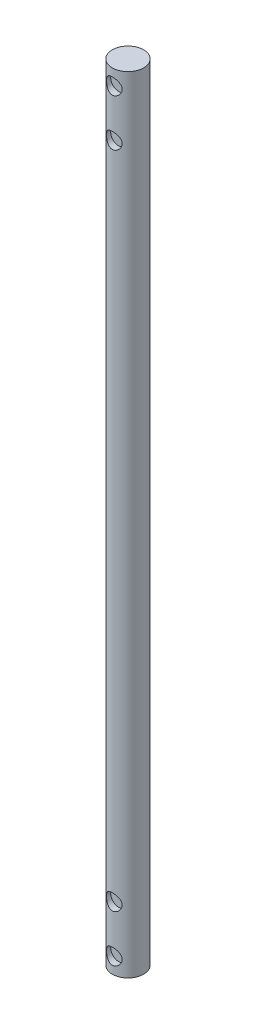
ISO-10303-21;
HEADER;
FILE_DESCRIPTION(('STEP AP214'),'2;1');
FILE_NAME('part.step','',(''),(''),'','','');
FILE_SCHEMA(('AUTOMOTIVE_DESIGN { 1 0 10303 214 1 1 1 1 }'));
ENDSEC;
DATA;
#1=APPLICATION_CONTEXT('core data for automotive mechanical design processes');
#2=APPLICATION_PROTOCOL_DEFINITION('international standard','automotive_design',2000,#1);
#3=PRODUCT_CONTEXT('',#1,'mechanical');
#4=PRODUCT('Part','Part','',(#3));
#5=PRODUCT_RELATED_PRODUCT_CATEGORY('part','',(#4));
#6=PRODUCT_DEFINITION_FORMATION('','',#4);
#7=PRODUCT_DEFINITION_CONTEXT('part definition',#1,'design');
#8=PRODUCT_DEFINITION('design','',#6,#7);
#9=PRODUCT_DEFINITION_SHAPE('','',#8);
#10=(LENGTH_UNIT() NAMED_UNIT(*) SI_UNIT(.MILLI.,.METRE.));
#11=(NAMED_UNIT(*) PLANE_ANGLE_UNIT() SI_UNIT($,.RADIAN.));
#12=(NAMED_UNIT(*) SI_UNIT($,.STERADIAN.) SOLID_ANGLE_UNIT());
#13=UNCERTAINTY_MEASURE_WITH_UNIT(LENGTH_MEASURE(1.E-05),#10,'distance_accuracy_value','');
#14=(GEOMETRIC_REPRESENTATION_CONTEXT(3) GLOBAL_UNCERTAINTY_ASSIGNED_CONTEXT((#13)) GLOBAL_UNIT_ASSIGNED_CONTEXT((#10,
#11,#12)) REPRESENTATION_CONTEXT('',''));
#15=CARTESIAN_POINT('',(0.,0.,0.));
#16=DIRECTION('',(0.,0.,1.));
#17=DIRECTION('',(1.,0.,0.));
#18=AXIS2_PLACEMENT_3D('',#15,#16,#17);
#19=CARTESIAN_POINT('',(0.,250.,0.));
#20=DIRECTION('',(0.,-1.,0.));
#21=DIRECTION('',(0.,0.,-1.));
#22=AXIS2_PLACEMENT_3D('',#19,#20,#21);
#23=CYLINDRICAL_SURFACE('',#22,5.);
#24=CARTESIAN_POINT('',(2.5,5.,4.33012701892219));
#25=CARTESIAN_POINT('',(2.49998948436432,4.86973349312351,4.33013982272992));
#26=CARTESIAN_POINT('',(2.48974954513168,4.73929727932375,4.33609541965583));
#27=CARTESIAN_POINT('',(2.44930840724944,4.48243102847077,4.35905877051907));
#28=CARTESIAN_POINT('',(2.41906526369545,4.35600999594271,4.37608974726023));
#29=CARTESIAN_POINT('',(2.3402497699757,4.11137105443893,4.41873376871659));
#30=CARTESIAN_POINT('',(2.29177485369963,3.99311342643779,4.44430111338921));
#31=CARTESIAN_POINT('',(2.17816884056414,3.76643943690545,4.50106659111455));
#32=CARTESIAN_POINT('',(2.11303684262671,3.65802360820421,4.53226502875883));
#33=CARTESIAN_POINT('',(1.96166634317253,3.44423569608308,4.59992173524851));
#34=CARTESIAN_POINT('',(1.87413008816917,3.33985216551023,4.63660159331577));
#35=CARTESIAN_POINT('',(1.68313452122752,3.1464790242868,4.70929956727453));
#36=CARTESIAN_POINT('',(1.57966731506051,3.05749709224505,4.74531734512768));
#37=CARTESIAN_POINT('',(1.35122390789082,2.89158212351436,4.81553692452135));
#38=CARTESIAN_POINT('',(1.22526797235894,2.81586558072086,4.84945266064072));
#39=CARTESIAN_POINT('',(0.960392566671146,2.68714786651614,4.90876890230193));
#40=CARTESIAN_POINT('',(0.821481345389982,2.6341323595615,4.93417477954535));
#41=CARTESIAN_POINT('',(0.545112359773522,2.55623834683603,4.9720115311507));
#42=CARTESIAN_POINT('',(0.408254476210982,2.52962618413487,4.98523700553425));
#43=CARTESIAN_POINT('',(0.131426571755676,2.49958470328871,5.00018959613973));
#44=CARTESIAN_POINT('',(-0.00854151460650916,2.49614135800464,5.00192366961168));
#45=CARTESIAN_POINT('',(-0.274581311061965,2.51186668493142,4.99407454791405));
#46=CARTESIAN_POINT('',(-0.400802997942672,2.52909503880454,4.98546239730476));
#47=CARTESIAN_POINT('',(-0.64828442979511,2.58220210976015,4.95935613149294));
#48=CARTESIAN_POINT('',(-0.769543802734626,2.61808222244016,4.94186135165964));
#49=CARTESIAN_POINT('',(-1.00577347892407,2.70770641522494,4.89928958219156));
#50=CARTESIAN_POINT('',(-1.120633558788,2.76169078293028,4.87411103823003));
#51=CARTESIAN_POINT('',(-1.33994200378327,2.88565854050362,4.81844114966712));
#52=CARTESIAN_POINT('',(-1.4443866220966,2.95564765825584,4.78794790393709));
#53=CARTESIAN_POINT('',(-1.6504341522455,3.11723837883257,4.72110985998075));
#54=CARTESIAN_POINT('',(-1.75083518757341,3.21025757081503,4.68448439995438));
#55=CARTESIAN_POINT('',(-1.93526092574445,3.41147431232543,4.61135851467029));
#56=CARTESIAN_POINT('',(-2.01927302893558,3.51968343068515,4.57485820664072));
#57=CARTESIAN_POINT('',(-2.17376333660553,3.75662048106022,4.50360390231212));
#58=CARTESIAN_POINT('',(-2.24304328744513,3.88621505763553,4.46910799976769));
#59=CARTESIAN_POINT('',(-2.35829778250308,4.1573441783975,4.4093862569644));
#60=CARTESIAN_POINT('',(-2.40429664552722,4.29886608254391,4.38415075115168));
#61=CARTESIAN_POINT('',(-2.4679505275626,4.57803627820697,4.34861589542586));
#62=CARTESIAN_POINT('',(-2.48756280529994,4.71510279760887,4.33729139621241));
#63=CARTESIAN_POINT('',(-2.50379236652857,4.99100335379136,4.32794798404024));
#64=CARTESIAN_POINT('',(-2.50042589328757,5.1298360727995,4.32991967223279));
#65=CARTESIAN_POINT('',(-2.47259010835991,5.3891347964468,4.34585841351462));
#66=CARTESIAN_POINT('',(-2.45046954178116,5.50994862776973,4.35848968766635));
#67=CARTESIAN_POINT('',(-2.38924071158112,5.74591946567748,4.39235053878353));
#68=CARTESIAN_POINT('',(-2.35012694655908,5.86107462686685,4.41358290012585));
#69=CARTESIAN_POINT('',(-2.25411897151217,6.08852832725639,4.46340555199141));
#70=CARTESIAN_POINT('',(-2.19648515923162,6.20044754213256,4.49229108107657));
#71=CARTESIAN_POINT('',(-2.0657176600397,6.4136731788488,4.55390298743125));
#72=CARTESIAN_POINT('',(-1.99257601083123,6.51497410878814,4.58663133387872));
#73=CARTESIAN_POINT('',(-1.82209291799636,6.71744691880332,4.65719996140836));
#74=CARTESIAN_POINT('',(-1.72286318078435,6.81699287677222,4.69516457885708));
#75=CARTESIAN_POINT('',(-1.5085112384988,6.99853059500591,4.76835587444746));
#76=CARTESIAN_POINT('',(-1.39338368664988,7.08051642565855,4.80358162519329));
#77=CARTESIAN_POINT('',(-1.14633840638507,7.22643431479089,4.86853404227334));
#78=CARTESIAN_POINT('',(-1.01405774389062,7.28983279520846,4.89809104179855));
#79=CARTESIAN_POINT('',(-0.738805911647332,7.39284475996202,4.9470838739847));
#80=CARTESIAN_POINT('',(-0.595844253647067,7.43247912960512,4.96652859191746));
#81=CARTESIAN_POINT('',(-0.317449205674706,7.48342140935642,4.99168770453968));
#82=CARTESIAN_POINT('',(-0.182528609085377,7.49699468583034,4.99849819767838));
#83=CARTESIAN_POINT('',(0.0878149643374307,7.50210816749459,5.00105325940467));
#84=CARTESIAN_POINT('',(0.223237748727016,7.49365608566109,4.99680170177042));
#85=CARTESIAN_POINT('',(0.481344982671073,7.45645896960449,4.97834922085637));
#86=CARTESIAN_POINT('',(0.604280801321773,7.42908782836369,4.96482236636807));
#87=CARTESIAN_POINT('',(0.843614873664455,7.35668255024167,4.92980234191731));
#88=CARTESIAN_POINT('',(0.960012187087213,7.31164588036637,4.90830802955518));
#89=CARTESIAN_POINT('',(1.18855854199593,7.20318218126074,4.85814826741488));
#90=CARTESIAN_POINT('',(1.30031295715363,7.13905097531015,4.82921542506803));
#91=CARTESIAN_POINT('',(1.51193650408535,6.99510588985241,4.76720333344986));
#92=CARTESIAN_POINT('',(1.61180014305397,6.91528480737313,4.73412218229104));
#93=CARTESIAN_POINT('',(1.8072854232437,6.73300420555064,4.66321523550925));
#94=CARTESIAN_POINT('',(1.90149582349003,6.62908227399927,4.62524489658366));
#95=CARTESIAN_POINT('',(2.07165660492503,6.40638471461777,4.55157698284941));
#96=CARTESIAN_POINT('',(2.1475908315154,6.28759608580077,4.51588143910584));
#97=CARTESIAN_POINT('',(2.28108393396028,6.03336388233574,4.44998982823926));
#98=CARTESIAN_POINT('',(2.3379862797745,5.8975126115754,4.42000320346984));
#99=CARTESIAN_POINT('',(2.40494911880459,5.68677735048023,4.38370272660093));
#100=CARTESIAN_POINT('',(2.42419582683991,5.61544022430239,4.37305486646054));
#101=CARTESIAN_POINT('',(2.45635087255789,5.47095930315067,4.35507574170935));
#102=CARTESIAN_POINT('',(2.46926364179176,5.39781680904558,4.34774215854234));
#103=CARTESIAN_POINT('',(2.48591166201423,5.27049901345306,4.3382377954292));
#104=CARTESIAN_POINT('',(2.49118864979202,5.21658367848779,4.33520487024791));
#105=CARTESIAN_POINT('',(2.49823512543934,5.10845538368959,4.33114674911323));
#106=CARTESIAN_POINT('',(2.50000437866474,5.05424240418945,4.33012168747261));
#107=CARTESIAN_POINT('',(2.5,5.,4.33012701892219));
#108=B_SPLINE_CURVE_WITH_KNOTS('',3,(#24,#25,#26,#27,#28,#29,#30,#31,#32,#33,#34,#35,#36,#37,
#38,#39,#40,#41,#42,#43,#44,#45,#46,#47,#48,#49,#50,#51,#52,#53,#54,#55,#56,#57,#58,#59,#60,#61,
#62,#63,#64,#65,#66,#67,#68,#69,#70,#71,#72,#73,#74,#75,#76,#77,#78,#79,#80,#81,#82,#83,#84,#85,
#86,#87,#88,#89,#90,#91,#92,#93,#94,#95,#96,#97,#98,#99,#100,#101,#102,#103,#104,#105,#106,
#107),.UNSPECIFIED.,.T.,.F.,(4,2,2,2,2,2,2,2,2,2,2,2,2,2,2,2,2,2,2,2,2,2,2,2,2,2,2,2,2,2,2,2,2,
2,2,2,2,2,2,2,2,4),(0.,0.390580306486788,0.781982232062012,1.17132148982692,1.56068181366371,
1.98215578129642,2.40383927716011,2.85394730601992,3.30377067414811,3.72158712424921,
4.13915059220183,4.52040243716429,4.90168281298721,5.2882383683295,5.67493248380763,
6.0981797864731,6.5217512061988,6.97222104328704,7.42221935534346,7.83655727140613,
8.25060232976016,8.61935458565147,8.98822631095241,9.37418241020303,9.76033715555202,
10.1951685895662,10.6301466245059,11.076604535375,11.5226694952701,11.927806759788,
12.3328021699001,12.7111106218382,13.0894733378512,13.4840187680376,13.8787457525688,
14.3127560463025,14.7471485711797,15.195268726016,15.4189244153949,15.6424233996907,
15.8050484542806,15.9676843870379),.UNSPECIFIED.);
#109=CARTESIAN_POINT('',(2.5,5.,4.33012701892219));
#110=VERTEX_POINT('',#109);
#111=EDGE_CURVE('E10',#110,#110,#108,.T.);
#112=ORIENTED_EDGE('',*,*,#111,.T.);
#113=EDGE_LOOP('',(#112));
#114=FACE_BOUND('',#113,.T.);
#115=CARTESIAN_POINT('',(2.5,230.,4.3301270189222));
#116=CARTESIAN_POINT('',(2.49998948436432,229.869733493123,4.33013982272992));
#117=CARTESIAN_POINT('',(2.48974954513168,229.739297279324,4.33609541965583));
#118=CARTESIAN_POINT('',(2.44930840724943,229.482431028471,4.35905877051907));
#119=CARTESIAN_POINT('',(2.41906526369545,229.356009995943,4.37608974726023));
#120=CARTESIAN_POINT('',(2.3402497699757,229.111371054439,4.41873376871659));
#121=CARTESIAN_POINT('',(2.29177485369963,228.993113426438,4.44430111338921));
#122=CARTESIAN_POINT('',(2.17816884056415,228.766439436905,4.50106659111455));
#123=CARTESIAN_POINT('',(2.11303684262672,228.658023608204,4.53226502875883));
#124=CARTESIAN_POINT('',(1.96166634317254,228.444235696083,4.5999217352485));
#125=CARTESIAN_POINT('',(1.87413008816918,228.33985216551,4.63660159331577));
#126=CARTESIAN_POINT('',(1.68313452122752,228.146479024287,4.70929956727453));
#127=CARTESIAN_POINT('',(1.57966731506051,228.057497092245,4.74531734512768));
#128=CARTESIAN_POINT('',(1.35122390789082,227.891582123514,4.81553692452135));
#129=CARTESIAN_POINT('',(1.22526797235894,227.815865580721,4.84945266064072));
#130=CARTESIAN_POINT('',(0.960392566671146,227.687147866516,4.90876890230193));
#131=CARTESIAN_POINT('',(0.82148134538998,227.634132359562,4.93417477954535));
#132=CARTESIAN_POINT('',(0.54511235977352,227.556238346836,4.9720115311507));
#133=CARTESIAN_POINT('',(0.408254476210981,227.529626184135,4.98523700553425));
#134=CARTESIAN_POINT('',(0.131426571755676,227.499584703289,5.00018959613973));
#135=CARTESIAN_POINT('',(-0.00854151460650794,227.496141358005,5.00192366961168));
#136=CARTESIAN_POINT('',(-0.274581311061965,227.511866684931,4.99407454791405));
#137=CARTESIAN_POINT('',(-0.400802997942676,227.529095038805,4.98546239730476));
#138=CARTESIAN_POINT('',(-0.648284429795113,227.58220210976,4.95935613149294));
#139=CARTESIAN_POINT('',(-0.769543802734627,227.61808222244,4.94186135165964));
#140=CARTESIAN_POINT('',(-1.00577347892408,227.707706415225,4.89928958219156));
#141=CARTESIAN_POINT('',(-1.120633558788,227.76169078293,4.87411103823003));
#142=CARTESIAN_POINT('',(-1.33994200378328,227.885658540504,4.81844114966712));
#143=CARTESIAN_POINT('',(-1.44438662209661,227.955647658256,4.78794790393709));
#144=CARTESIAN_POINT('',(-1.65043415224551,228.117238378833,4.72110985998074));
#145=CARTESIAN_POINT('',(-1.7508351875734,228.210257570815,4.68448439995438));
#146=CARTESIAN_POINT('',(-1.93526092574445,228.411474312325,4.61135851467029));
#147=CARTESIAN_POINT('',(-2.01927302893558,228.519683430685,4.57485820664072));
#148=CARTESIAN_POINT('',(-2.17376333660552,228.75662048106,4.50360390231212));
#149=CARTESIAN_POINT('',(-2.24304328744511,228.886215057635,4.4691079997677));
#150=CARTESIAN_POINT('',(-2.35829778250307,229.157344178397,4.4093862569644));
#151=CARTESIAN_POINT('',(-2.40429664552722,229.298866082544,4.38415075115169));
#152=CARTESIAN_POINT('',(-2.4679505275626,229.578036278207,4.34861589542586));
#153=CARTESIAN_POINT('',(-2.48756280529994,229.715102797609,4.33729139621241));
#154=CARTESIAN_POINT('',(-2.50379236652858,229.991003353791,4.32794798404023));
#155=CARTESIAN_POINT('',(-2.50042589328758,230.129836072799,4.32991967223278));
#156=CARTESIAN_POINT('',(-2.47259010835992,230.389134796447,4.34585841351462));
#157=CARTESIAN_POINT('',(-2.45046954178117,230.50994862777,4.35848968766634));
#158=CARTESIAN_POINT('',(-2.38924071158113,230.745919465677,4.39235053878352));
#159=CARTESIAN_POINT('',(-2.3501269465591,230.861074626867,4.41358290012584));
#160=CARTESIAN_POINT('',(-2.25411897151218,231.088528327256,4.46340555199141));
#161=CARTESIAN_POINT('',(-2.19648515923164,231.200447542133,4.49229108107657));
#162=CARTESIAN_POINT('',(-2.06571766003971,231.413673178849,4.55390298743125));
#163=CARTESIAN_POINT('',(-1.99257601083124,231.514974108788,4.58663133387872));
#164=CARTESIAN_POINT('',(-1.82209291799637,231.717446918803,4.65719996140836));
#165=CARTESIAN_POINT('',(-1.72286318078436,231.816992876772,4.69516457885707));
#166=CARTESIAN_POINT('',(-1.50851123849882,231.998530595006,4.76835587444745));
#167=CARTESIAN_POINT('',(-1.3933836866499,232.080516425659,4.80358162519329));
#168=CARTESIAN_POINT('',(-1.1463384063851,232.226434314791,4.86853404227334));
#169=CARTESIAN_POINT('',(-1.01405774389064,232.289832795208,4.89809104179854));
#170=CARTESIAN_POINT('',(-0.738805911647361,232.392844759962,4.9470838739847));
#171=CARTESIAN_POINT('',(-0.595844253647096,232.432479129605,4.96652859191746));
#172=CARTESIAN_POINT('',(-0.317449205674733,232.483421409356,4.99168770453968));
#173=CARTESIAN_POINT('',(-0.182528609085401,232.49699468583,4.99849819767838));
#174=CARTESIAN_POINT('',(0.0878149643374111,232.502108167495,5.00105325940467));
#175=CARTESIAN_POINT('',(0.223237748727,232.493656085661,4.99680170177042));
#176=CARTESIAN_POINT('',(0.481344982671057,232.456458969604,4.97834922085637));
#177=CARTESIAN_POINT('',(0.604280801321756,232.429087828364,4.96482236636807));
#178=CARTESIAN_POINT('',(0.84361487366444,232.356682550242,4.92980234191731));
#179=CARTESIAN_POINT('',(0.960012187087201,232.311645880366,4.90830802955518));
#180=CARTESIAN_POINT('',(1.18855854199592,232.203182181261,4.85814826741488));
#181=CARTESIAN_POINT('',(1.30031295715362,232.13905097531,4.82921542506803));
#182=CARTESIAN_POINT('',(1.51193650408534,231.995105889852,4.76720333344986));
#183=CARTESIAN_POINT('',(1.61180014305396,231.915284807373,4.73412218229105));
#184=CARTESIAN_POINT('',(1.80728542324368,231.733004205551,4.66321523550926));
#185=CARTESIAN_POINT('',(1.90149582349001,231.629082273999,4.62524489658367));
#186=CARTESIAN_POINT('',(2.07165660492502,231.406384714618,4.55157698284942));
#187=CARTESIAN_POINT('',(2.14759083151539,231.287596085801,4.51588143910585));
#188=CARTESIAN_POINT('',(2.28108393396028,231.033363882336,4.44998982823927));
#189=CARTESIAN_POINT('',(2.33798627977448,230.897512611575,4.42000320346984));
#190=CARTESIAN_POINT('',(2.40494911880457,230.68677735048,4.38370272660094));
#191=CARTESIAN_POINT('',(2.42419582683989,230.615440224302,4.37305486646055));
#192=CARTESIAN_POINT('',(2.45635087255788,230.470959303151,4.35507574170935));
#193=CARTESIAN_POINT('',(2.46926364179176,230.397816809046,4.34774215854234));
#194=CARTESIAN_POINT('',(2.48591166201423,230.270499013453,4.33823779542921));
#195=CARTESIAN_POINT('',(2.49118864979202,230.216583678488,4.33520487024791));
#196=CARTESIAN_POINT('',(2.49823512543933,230.10845538369,4.33114674911323));
#197=CARTESIAN_POINT('',(2.50000437866474,230.054242404189,4.33012168747261));
#198=CARTESIAN_POINT('',(2.5,230.,4.3301270189222));
#199=B_SPLINE_CURVE_WITH_KNOTS('',3,(#115,#116,#117,#118,#119,#120,#121,#122,#123,#124,#125,
#126,#127,#128,#129,#130,#131,#132,#133,#134,#135,#136,#137,#138,#139,#140,#141,#142,#143,#144,
#145,#146,#147,#148,#149,#150,#151,#152,#153,#154,#155,#156,#157,#158,#159,#160,#161,#162,#163,
#164,#165,#166,#167,#168,#169,#170,#171,#172,#173,#174,#175,#176,#177,#178,#179,#180,#181,#182,
#183,#184,#185,#186,#187,#188,#189,#190,#191,#192,#193,#194,#195,#196,#197,#198),.UNSPECIFIED.,
.T.,.F.,(4,2,2,2,2,2,2,2,2,2,2,2,2,2,2,2,2,2,2,2,2,2,2,2,2,2,2,2,2,2,2,2,2,2,2,2,2,2,2,2,2,4),
(0.,0.390580306486788,0.781982232062008,1.17132148982689,1.56068181366368,1.98215578129641,
2.40383927716012,2.85394730601992,3.30377067414811,3.72158712424921,4.13915059220183,
4.52040243716429,4.90168281298721,5.28823836832951,5.67493248380763,6.0981797864731,
6.5217512061988,6.97222104328697,7.42221935534341,7.83655727140605,8.25060232976015,
8.61935458565147,8.9882263109524,9.37418241020302,9.76033715555204,10.1951685895662,
10.6301466245059,11.076604535375,11.5226694952701,11.927806759788,12.3328021699001,
12.7111106218382,13.0894733378512,13.4840187680376,13.8787457525688,14.3127560463025,
14.7471485711797,15.1952687260159,15.4189244153949,15.6424233996907,15.8050484542806,
15.9676843870379),.UNSPECIFIED.);
#200=CARTESIAN_POINT('',(2.5,230.,4.3301270189222));
#201=VERTEX_POINT('',#200);
#202=EDGE_CURVE('E49',#201,#201,#199,.T.);
#203=ORIENTED_EDGE('',*,*,#202,.T.);
#204=EDGE_LOOP('',(#203));
#205=FACE_BOUND('',#204,.T.);
#206=CARTESIAN_POINT('',(2.49999999999999,245.,4.3301270189222));
#207=CARTESIAN_POINT('',(2.49998948436431,244.869733493124,4.33013982272992));
#208=CARTESIAN_POINT('',(2.48974954513168,244.739297279324,4.33609541965583));
#209=CARTESIAN_POINT('',(2.44930840724943,244.482431028471,4.35905877051908));
#210=CARTESIAN_POINT('',(2.41906526369544,244.356009995943,4.37608974726023));
#211=CARTESIAN_POINT('',(2.3402497699757,244.111371054439,4.41873376871659));
#212=CARTESIAN_POINT('',(2.29177485369963,243.993113426438,4.44430111338921));
#213=CARTESIAN_POINT('',(2.17816884056415,243.766439436905,4.50106659111455));
#214=CARTESIAN_POINT('',(2.11303684262672,243.658023608204,4.53226502875883));
#215=CARTESIAN_POINT('',(1.96166634317254,243.444235696083,4.5999217352485));
#216=CARTESIAN_POINT('',(1.87413008816917,243.33985216551,4.63660159331577));
#217=CARTESIAN_POINT('',(1.68313452122751,243.146479024287,4.70929956727453));
#218=CARTESIAN_POINT('',(1.57966731506051,243.057497092245,4.74531734512768));
#219=CARTESIAN_POINT('',(1.35122390789082,242.891582123514,4.81553692452135));
#220=CARTESIAN_POINT('',(1.22526797235894,242.815865580721,4.84945266064072));
#221=CARTESIAN_POINT('',(0.960392566671143,242.687147866516,4.90876890230193));
#222=CARTESIAN_POINT('',(0.821481345389977,242.634132359562,4.93417477954535));
#223=CARTESIAN_POINT('',(0.545112359773515,242.556238346836,4.9720115311507));
#224=CARTESIAN_POINT('',(0.408254476210974,242.529626184135,4.98523700553425));
#225=CARTESIAN_POINT('',(0.13142657175567,242.499584703289,5.00018959613973));
#226=CARTESIAN_POINT('',(-0.00854151460651231,242.496141358005,5.00192366961168));
#227=CARTESIAN_POINT('',(-0.274581311061965,242.511866684931,4.99407454791405));
#228=CARTESIAN_POINT('',(-0.400802997942673,242.529095038805,4.98546239730476));
#229=CARTESIAN_POINT('',(-0.648284429795111,242.58220210976,4.95935613149294));
#230=CARTESIAN_POINT('',(-0.769543802734626,242.61808222244,4.94186135165964));
#231=CARTESIAN_POINT('',(-1.00577347892408,242.707706415225,4.89928958219156));
#232=CARTESIAN_POINT('',(-1.120633558788,242.76169078293,4.87411103823003));
#233=CARTESIAN_POINT('',(-1.33994200378328,242.885658540504,4.81844114966712));
#234=CARTESIAN_POINT('',(-1.44438662209661,242.955647658256,4.78794790393709));
#235=CARTESIAN_POINT('',(-1.65043415224551,243.117238378833,4.72110985998074));
#236=CARTESIAN_POINT('',(-1.75083518757341,243.210257570815,4.68448439995438));
#237=CARTESIAN_POINT('',(-1.93526092574445,243.411474312325,4.61135851467029));
#238=CARTESIAN_POINT('',(-2.01927302893558,243.519683430685,4.57485820664072));
#239=CARTESIAN_POINT('',(-2.17376333660553,243.75662048106,4.50360390231211));
#240=CARTESIAN_POINT('',(-2.24304328744513,243.886215057636,4.46910799976769));
#241=CARTESIAN_POINT('',(-2.35829778250308,244.157344178397,4.4093862569644));
#242=CARTESIAN_POINT('',(-2.40429664552722,244.298866082544,4.38415075115168));
#243=CARTESIAN_POINT('',(-2.4679505275626,244.578036278207,4.34861589542586));
#244=CARTESIAN_POINT('',(-2.48756280529994,244.715102797609,4.33729139621241));
#245=CARTESIAN_POINT('',(-2.50379236652858,244.991003353791,4.32794798404023));
#246=CARTESIAN_POINT('',(-2.50042589328758,245.129836072799,4.32991967223278));
#247=CARTESIAN_POINT('',(-2.47259010835992,245.389134796447,4.34585841351461));
#248=CARTESIAN_POINT('',(-2.45046954178117,245.50994862777,4.35848968766634));
#249=CARTESIAN_POINT('',(-2.38924071158113,245.745919465677,4.39235053878352));
#250=CARTESIAN_POINT('',(-2.3501269465591,245.861074626867,4.41358290012584));
#251=CARTESIAN_POINT('',(-2.25411897151218,246.088528327256,4.46340555199141));
#252=CARTESIAN_POINT('',(-2.19648515923164,246.200447542133,4.49229108107656));
#253=CARTESIAN_POINT('',(-2.06571766003971,246.413673178849,4.55390298743125));
#254=CARTESIAN_POINT('',(-1.99257601083124,246.514974108788,4.58663133387872));
#255=CARTESIAN_POINT('',(-1.82209291799637,246.717446918803,4.65719996140836));
#256=CARTESIAN_POINT('',(-1.72286318078436,246.816992876772,4.69516457885707));
#257=CARTESIAN_POINT('',(-1.50851123849882,246.998530595006,4.76835587444745));
#258=CARTESIAN_POINT('',(-1.3933836866499,247.080516425659,4.80358162519329));
#259=CARTESIAN_POINT('',(-1.1463384063851,247.226434314791,4.86853404227334));
#260=CARTESIAN_POINT('',(-1.01405774389065,247.289832795208,4.89809104179855));
#261=CARTESIAN_POINT('',(-0.738805911647361,247.392844759962,4.9470838739847));
#262=CARTESIAN_POINT('',(-0.595844253647096,247.432479129605,4.96652859191746));
#263=CARTESIAN_POINT('',(-0.317449205674734,247.483421409356,4.99168770453968));
#264=CARTESIAN_POINT('',(-0.182528609085403,247.49699468583,4.99849819767838));
#265=CARTESIAN_POINT('',(0.0878149643374065,247.502108167495,5.00105325940467));
#266=CARTESIAN_POINT('',(0.223237748726994,247.493656085661,4.99680170177042));
#267=CARTESIAN_POINT('',(0.481344982671052,247.456458969605,4.97834922085637));
#268=CARTESIAN_POINT('',(0.604280801321751,247.429087828364,4.96482236636807));
#269=CARTESIAN_POINT('',(0.843614873664436,247.356682550242,4.92980234191731));
#270=CARTESIAN_POINT('',(0.960012187087198,247.311645880366,4.90830802955518));
#271=CARTESIAN_POINT('',(1.18855854199591,247.203182181261,4.85814826741488));
#272=CARTESIAN_POINT('',(1.30031295715361,247.13905097531,4.82921542506803));
#273=CARTESIAN_POINT('',(1.51193650408534,246.995105889852,4.76720333344986));
#274=CARTESIAN_POINT('',(1.61180014305396,246.915284807373,4.73412218229105));
#275=CARTESIAN_POINT('',(1.80728542324368,246.733004205551,4.66321523550926));
#276=CARTESIAN_POINT('',(1.90149582349001,246.629082273999,4.62524489658367));
#277=CARTESIAN_POINT('',(2.07165660492502,246.406384714618,4.55157698284942));
#278=CARTESIAN_POINT('',(2.14759083151539,246.287596085801,4.51588143910585));
#279=CARTESIAN_POINT('',(2.28108393396027,246.033363882336,4.44998982823927));
#280=CARTESIAN_POINT('',(2.33798627977448,245.897512611575,4.42000320346985));
#281=CARTESIAN_POINT('',(2.40494911880457,245.68677735048,4.38370272660094));
#282=CARTESIAN_POINT('',(2.42419582683989,245.615440224302,4.37305486646055));
#283=CARTESIAN_POINT('',(2.45635087255787,245.470959303151,4.35507574170935));
#284=CARTESIAN_POINT('',(2.46926364179175,245.397816809046,4.34774215854234));
#285=CARTESIAN_POINT('',(2.48591166201423,245.270499013453,4.33823779542921));
#286=CARTESIAN_POINT('',(2.49118864979202,245.216583678488,4.33520487024791));
#287=CARTESIAN_POINT('',(2.49823512543933,245.10845538369,4.33114674911323));
#288=CARTESIAN_POINT('',(2.50000437866474,245.054242404189,4.33012168747261));
#289=CARTESIAN_POINT('',(2.49999999999999,245.,4.3301270189222));
#290=B_SPLINE_CURVE_WITH_KNOTS('',3,(#206,#207,#208,#209,#210,#211,#212,#213,#214,#215,#216,
#217,#218,#219,#220,#221,#222,#223,#224,#225,#226,#227,#228,#229,#230,#231,#232,#233,#234,#235,
#236,#237,#238,#239,#240,#241,#242,#243,#244,#245,#246,#247,#248,#249,#250,#251,#252,#253,#254,
#255,#256,#257,#258,#259,#260,#261,#262,#263,#264,#265,#266,#267,#268,#269,#270,#271,#272,#273,
#274,#275,#276,#277,#278,#279,#280,#281,#282,#283,#284,#285,#286,#287,#288,#289),.UNSPECIFIED.,
.T.,.F.,(4,2,2,2,2,2,2,2,2,2,2,2,2,2,2,2,2,2,2,2,2,2,2,2,2,2,2,2,2,2,2,2,2,2,2,2,2,2,2,2,2,4),
(0.,0.390580306486788,0.781982232062008,1.17132148982689,1.56068181366368,1.9821557812964,
2.40383927716012,2.85394730601992,3.30377067414811,3.72158712424922,4.13915059220183,
4.52040243716428,4.90168281298721,5.28823836832951,5.67493248380763,6.09817978647309,
6.5217512061988,6.97222104328703,7.42221935534344,7.83655727140608,8.25060232976015,
8.61935458565146,8.9882263109524,9.37418241020302,9.76033715555203,10.1951685895662,
10.6301466245059,11.076604535375,11.5226694952701,11.927806759788,12.3328021699001,
12.7111106218381,13.0894733378512,13.4840187680376,13.8787457525688,14.3127560463025,
14.7471485711797,15.1952687260159,15.4189244153949,15.6424233996907,15.8050484542806,
15.9676843870379),.UNSPECIFIED.);
#291=CARTESIAN_POINT('',(2.49999999999999,245.,4.3301270189222));
#292=VERTEX_POINT('',#291);
#293=EDGE_CURVE('E54',#292,#292,#290,.T.);
#294=ORIENTED_EDGE('',*,*,#293,.T.);
#295=EDGE_LOOP('',(#294));
#296=FACE_BOUND('',#295,.T.);
#297=CARTESIAN_POINT('',(2.5,20.,4.33012701892219));
#298=CARTESIAN_POINT('',(2.49998948436432,19.8697334931235,4.33013982272992));
#299=CARTESIAN_POINT('',(2.48974954513168,19.7392972793238,4.33609541965583));
#300=CARTESIAN_POINT('',(2.44930840724944,19.4824310284708,4.35905877051907));
#301=CARTESIAN_POINT('',(2.41906526369545,19.3560099959427,4.37608974726023));
#302=CARTESIAN_POINT('',(2.3402497699757,19.1113710544389,4.41873376871659));
#303=CARTESIAN_POINT('',(2.29177485369963,18.9931134264378,4.44430111338921));
#304=CARTESIAN_POINT('',(2.17816884056414,18.7664394369055,4.50106659111455));
#305=CARTESIAN_POINT('',(2.11303684262671,18.6580236082042,4.53226502875883));
#306=CARTESIAN_POINT('',(1.96166634317253,18.4442356960831,4.59992173524851));
#307=CARTESIAN_POINT('',(1.87413008816917,18.3398521655102,4.63660159331577));
#308=CARTESIAN_POINT('',(1.68313452122751,18.1464790242868,4.70929956727453));
#309=CARTESIAN_POINT('',(1.57966731506051,18.0574970922451,4.74531734512768));
#310=CARTESIAN_POINT('',(1.35122390789082,17.8915821235144,4.81553692452135));
#311=CARTESIAN_POINT('',(1.22526797235894,17.8158655807209,4.84945266064072));
#312=CARTESIAN_POINT('',(0.960392566671145,17.6871478665161,4.90876890230193));
#313=CARTESIAN_POINT('',(0.821481345389981,17.6341323595615,4.93417477954535));
#314=CARTESIAN_POINT('',(0.545112359773521,17.556238346836,4.9720115311507));
#315=CARTESIAN_POINT('',(0.408254476210981,17.5296261841349,4.98523700553425));
#316=CARTESIAN_POINT('',(0.131426571755676,17.4995847032887,5.00018959613973));
#317=CARTESIAN_POINT('',(-0.00854151460650786,17.4961413580046,5.00192366961168));
#318=CARTESIAN_POINT('',(-0.274581311061963,17.5118666849314,4.99407454791405));
#319=CARTESIAN_POINT('',(-0.400802997942671,17.5290950388045,4.98546239730476));
#320=CARTESIAN_POINT('',(-0.648284429795109,17.5822021097602,4.95935613149294));
#321=CARTESIAN_POINT('',(-0.769543802734625,17.6180822224402,4.94186135165964));
#322=CARTESIAN_POINT('',(-1.00577347892407,17.7077064152249,4.89928958219157));
#323=CARTESIAN_POINT('',(-1.120633558788,17.7616907829303,4.87411103823003));
#324=CARTESIAN_POINT('',(-1.33994200378327,17.8856585405036,4.81844114966712));
#325=CARTESIAN_POINT('',(-1.4443866220966,17.9556476582558,4.78794790393709));
#326=CARTESIAN_POINT('',(-1.6504341522455,18.1172383788326,4.72110985998075));
#327=CARTESIAN_POINT('',(-1.7508351875734,18.210257570815,4.68448439995438));
#328=CARTESIAN_POINT('',(-1.93526092574444,18.4114743123254,4.61135851467029));
#329=CARTESIAN_POINT('',(-2.01927302893557,18.5196834306852,4.57485820664072));
#330=CARTESIAN_POINT('',(-2.17376333660553,18.7566204810602,4.50360390231212));
#331=CARTESIAN_POINT('',(-2.24304328744513,18.8862150576355,4.46910799976769));
#332=CARTESIAN_POINT('',(-2.35829778250308,19.1573441783975,4.4093862569644));
#333=CARTESIAN_POINT('',(-2.40429664552722,19.2988660825439,4.38415075115168));
#334=CARTESIAN_POINT('',(-2.4679505275626,19.578036278207,4.34861589542586));
#335=CARTESIAN_POINT('',(-2.48756280529994,19.7151027976089,4.33729139621241));
#336=CARTESIAN_POINT('',(-2.50379236652857,19.9910033537914,4.32794798404024));
#337=CARTESIAN_POINT('',(-2.50042589328757,20.1298360727995,4.32991967223279));
#338=CARTESIAN_POINT('',(-2.47259010835991,20.3891347964468,4.34585841351462));
#339=CARTESIAN_POINT('',(-2.45046954178116,20.5099486277697,4.35848968766635));
#340=CARTESIAN_POINT('',(-2.38924071158111,20.7459194656775,4.39235053878353));
#341=CARTESIAN_POINT('',(-2.35012694655908,20.8610746268669,4.41358290012585));
#342=CARTESIAN_POINT('',(-2.25411897151217,21.0885283272564,4.46340555199141));
#343=CARTESIAN_POINT('',(-2.19648515923163,21.2004475421326,4.49229108107657));
#344=CARTESIAN_POINT('',(-2.0657176600397,21.4136731788488,4.55390298743125));
#345=CARTESIAN_POINT('',(-1.99257601083123,21.5149741087881,4.58663133387872));
#346=CARTESIAN_POINT('',(-1.82209291799636,21.7174469188033,4.65719996140836));
#347=CARTESIAN_POINT('',(-1.72286318078434,21.8169928767722,4.69516457885708));
#348=CARTESIAN_POINT('',(-1.50851123849879,21.9985305950059,4.76835587444746));
#349=CARTESIAN_POINT('',(-1.39338368664988,22.0805164256585,4.80358162519329));
#350=CARTESIAN_POINT('',(-1.14633840638507,22.2264343147909,4.86853404227334));
#351=CARTESIAN_POINT('',(-1.01405774389062,22.2898327952085,4.89809104179855));
#352=CARTESIAN_POINT('',(-0.738805911647331,22.392844759962,4.9470838739847));
#353=CARTESIAN_POINT('',(-0.595844253647066,22.4324791296051,4.96652859191746));
#354=CARTESIAN_POINT('',(-0.317449205674706,22.4834214093564,4.99168770453968));
#355=CARTESIAN_POINT('',(-0.182528609085377,22.4969946858303,4.99849819767838));
#356=CARTESIAN_POINT('',(0.08781496433743,22.5021081674946,5.00105325940467));
#357=CARTESIAN_POINT('',(0.223237748727016,22.4936560856611,4.99680170177042));
#358=CARTESIAN_POINT('',(0.481344982671072,22.4564589696045,4.97834922085637));
#359=CARTESIAN_POINT('',(0.604280801321772,22.4290878283637,4.96482236636807));
#360=CARTESIAN_POINT('',(0.843614873664454,22.3566825502417,4.92980234191731));
#361=CARTESIAN_POINT('',(0.960012187087213,22.3116458803664,4.90830802955518));
#362=CARTESIAN_POINT('',(1.18855854199593,22.2031821812607,4.85814826741488));
#363=CARTESIAN_POINT('',(1.30031295715363,22.1390509753102,4.82921542506803));
#364=CARTESIAN_POINT('',(1.51193650408535,21.9951058898524,4.76720333344986));
#365=CARTESIAN_POINT('',(1.61180014305397,21.9152848073731,4.73412218229104));
#366=CARTESIAN_POINT('',(1.80728542324369,21.7330042055506,4.66321523550925));
#367=CARTESIAN_POINT('',(1.90149582349003,21.6290822739993,4.62524489658366));
#368=CARTESIAN_POINT('',(2.07165660492503,21.4063847146178,4.55157698284941));
#369=CARTESIAN_POINT('',(2.1475908315154,21.2875960858008,4.51588143910584));
#370=CARTESIAN_POINT('',(2.28108393396028,21.0333638823357,4.44998982823926));
#371=CARTESIAN_POINT('',(2.3379862797745,20.8975126115754,4.42000320346984));
#372=CARTESIAN_POINT('',(2.40494911880459,20.6867773504802,4.38370272660093));
#373=CARTESIAN_POINT('',(2.42419582683991,20.6154402243024,4.37305486646054));
#374=CARTESIAN_POINT('',(2.45635087255789,20.4709593031507,4.35507574170935));
#375=CARTESIAN_POINT('',(2.46926364179176,20.3978168090456,4.34774215854234));
#376=CARTESIAN_POINT('',(2.48591166201423,20.2704990134531,4.3382377954292));
#377=CARTESIAN_POINT('',(2.49118864979202,20.2165836784878,4.33520487024791));
#378=CARTESIAN_POINT('',(2.49823512543933,20.1084553836896,4.33114674911323));
#379=CARTESIAN_POINT('',(2.50000437866474,20.0542424041894,4.33012168747261));
#380=CARTESIAN_POINT('',(2.5,20.,4.33012701892219));
#381=B_SPLINE_CURVE_WITH_KNOTS('',3,(#297,#298,#299,#300,#301,#302,#303,#304,#305,#306,#307,
#308,#309,#310,#311,#312,#313,#314,#315,#316,#317,#318,#319,#320,#321,#322,#323,#324,#325,#326,
#327,#328,#329,#330,#331,#332,#333,#334,#335,#336,#337,#338,#339,#340,#341,#342,#343,#344,#345,
#346,#347,#348,#349,#350,#351,#352,#353,#354,#355,#356,#357,#358,#359,#360,#361,#362,#363,#364,
#365,#366,#367,#368,#369,#370,#371,#372,#373,#374,#375,#376,#377,#378,#379,#380),.UNSPECIFIED.,
.T.,.F.,(4,2,2,2,2,2,2,2,2,2,2,2,2,2,2,2,2,2,2,2,2,2,2,2,2,2,2,2,2,2,2,2,2,2,2,2,2,2,2,2,2,4),
(0.,0.390580306486785,0.781982232062012,1.17132148982692,1.5606818136637,1.98215578129642,
2.40383927716011,2.85394730601992,3.30377067414811,3.72158712424921,4.13915059220183,
4.52040243716429,4.90168281298721,5.2882383683295,5.67493248380763,6.0981797864731,
6.5217512061988,6.97222104328704,7.42221935534345,7.83655727140612,8.25060232976016,
8.61935458565147,8.98822631095241,9.37418241020302,9.76033715555202,10.1951685895662,
10.6301466245059,11.076604535375,11.5226694952701,11.927806759788,12.3328021699001,
12.7111106218381,13.0894733378512,13.4840187680376,13.8787457525688,14.3127560463025,
14.7471485711797,15.195268726016,15.4189244153949,15.6424233996907,15.8050484542806,
15.9676843870379),.UNSPECIFIED.);
#382=CARTESIAN_POINT('',(2.5,20.,4.33012701892219));
#383=VERTEX_POINT('',#382);
#384=EDGE_CURVE('E59',#383,#383,#381,.T.);
#385=ORIENTED_EDGE('',*,*,#384,.T.);
#386=EDGE_LOOP('',(#385));
#387=FACE_BOUND('',#386,.T.);
#388=CARTESIAN_POINT('',(0.,250.,0.));
#389=DIRECTION('',(0.,1.,0.));
#390=DIRECTION('',(0.,0.,1.));
#391=AXIS2_PLACEMENT_3D('',#388,#389,#390);
#392=CIRCLE('',#391,5.);
#393=CARTESIAN_POINT('',(0.,250.,5.));
#394=VERTEX_POINT('',#393);
#395=EDGE_CURVE('E95',#394,#394,#392,.T.);
#396=ORIENTED_EDGE('',*,*,#395,.F.);
#397=EDGE_LOOP('',(#396));
#398=FACE_BOUND('',#397,.T.);
#399=CARTESIAN_POINT('',(0.,0.,0.));
#400=DIRECTION('',(0.,1.,0.));
#401=DIRECTION('',(0.,0.,1.));
#402=AXIS2_PLACEMENT_3D('',#399,#400,#401);
#403=CIRCLE('',#402,5.);
#404=CARTESIAN_POINT('',(0.,0.,5.));
#405=VERTEX_POINT('',#404);
#406=EDGE_CURVE('E96',#405,#405,#403,.T.);
#407=ORIENTED_EDGE('',*,*,#406,.T.);
#408=EDGE_LOOP('',(#407));
#409=FACE_BOUND('',#408,.T.);
#410=ADVANCED_FACE('F37',(#114,#205,#296,#387,#398,#409),#23,.T.);
#411=CARTESIAN_POINT('',(0.,250.,0.));
#412=DIRECTION('',(0.,1.,0.));
#413=DIRECTION('',(0.,0.,1.));
#414=AXIS2_PLACEMENT_3D('',#411,#412,#413);
#415=PLANE('',#414);
#416=ORIENTED_EDGE('',*,*,#395,.T.);
#417=EDGE_LOOP('',(#416));
#418=FACE_BOUND('',#417,.T.);
#419=ADVANCED_FACE('F133',(#418),#415,.T.);
#420=CARTESIAN_POINT('',(0.,0.,0.));
#421=DIRECTION('',(0.,1.,0.));
#422=DIRECTION('',(0.,0.,1.));
#423=AXIS2_PLACEMENT_3D('',#420,#421,#422);
#424=PLANE('',#423);
#425=ORIENTED_EDGE('',*,*,#406,.F.);
#426=EDGE_LOOP('',(#425));
#427=FACE_BOUND('',#426,.T.);
#428=ADVANCED_FACE('F87',(#427),#424,.F.);
#429=CARTESIAN_POINT('',(0.,20.,3.));
#430=DIRECTION('',(0.,0.,1.));
#431=DIRECTION('',(1.,0.,0.));
#432=AXIS2_PLACEMENT_3D('',#429,#430,#431);
#433=CYLINDRICAL_SURFACE('',#432,2.5);
#434=CARTESIAN_POINT('',(0.,20.,3.));
#435=DIRECTION('',(0.,0.,1.));
#436=DIRECTION('',(1.,0.,0.));
#437=AXIS2_PLACEMENT_3D('',#434,#435,#436);
#438=CIRCLE('',#437,2.5);
#439=CARTESIAN_POINT('',(2.5,20.,3.));
#440=VERTEX_POINT('',#439);
#441=EDGE_CURVE('E108',#440,#440,#438,.T.);
#442=ORIENTED_EDGE('',*,*,#441,.F.);
#443=EDGE_LOOP('',(#442));
#444=FACE_BOUND('',#443,.T.);
#445=ORIENTED_EDGE('',*,*,#384,.F.);
#446=EDGE_LOOP('',(#445));
#447=FACE_BOUND('',#446,.T.);
#448=ADVANCED_FACE('F82',(#444,#447),#433,.F.);
#449=CARTESIAN_POINT('',(0.,20.,3.));
#450=DIRECTION('',(0.,0.,1.));
#451=DIRECTION('',(1.,0.,0.));
#452=AXIS2_PLACEMENT_3D('',#449,#450,#451);
#453=PLANE('',#452);
#454=ORIENTED_EDGE('',*,*,#441,.T.);
#455=EDGE_LOOP('',(#454));
#456=FACE_BOUND('',#455,.T.);
#457=ADVANCED_FACE('F78',(#456),#453,.T.);
#458=CARTESIAN_POINT('',(0.,245.,3.));
#459=DIRECTION('',(0.,0.,1.));
#460=DIRECTION('',(1.,0.,0.));
#461=AXIS2_PLACEMENT_3D('',#458,#459,#460);
#462=CYLINDRICAL_SURFACE('',#461,2.5);
#463=CARTESIAN_POINT('',(0.,245.,3.));
#464=DIRECTION('',(0.,0.,1.));
#465=DIRECTION('',(1.,0.,0.));
#466=AXIS2_PLACEMENT_3D('',#463,#464,#465);
#467=CIRCLE('',#466,2.5);
#468=CARTESIAN_POINT('',(2.49999999999999,245.,3.));
#469=VERTEX_POINT('',#468);
#470=EDGE_CURVE('E104',#469,#469,#467,.T.);
#471=ORIENTED_EDGE('',*,*,#470,.F.);
#472=EDGE_LOOP('',(#471));
#473=FACE_BOUND('',#472,.T.);
#474=ORIENTED_EDGE('',*,*,#293,.F.);
#475=EDGE_LOOP('',(#474));
#476=FACE_BOUND('',#475,.T.);
#477=ADVANCED_FACE('F81',(#473,#476),#462,.F.);
#478=CARTESIAN_POINT('',(0.,245.,3.));
#479=DIRECTION('',(0.,0.,1.));
#480=DIRECTION('',(1.,0.,0.));
#481=AXIS2_PLACEMENT_3D('',#478,#479,#480);
#482=PLANE('',#481);
#483=ORIENTED_EDGE('',*,*,#470,.T.);
#484=EDGE_LOOP('',(#483));
#485=FACE_BOUND('',#484,.T.);
#486=ADVANCED_FACE('F76',(#485),#482,.T.);
#487=CARTESIAN_POINT('',(0.,230.,3.));
#488=DIRECTION('',(0.,0.,1.));
#489=DIRECTION('',(1.,0.,0.));
#490=AXIS2_PLACEMENT_3D('',#487,#488,#489);
#491=CYLINDRICAL_SURFACE('',#490,2.5);
#492=CARTESIAN_POINT('',(0.,230.,3.));
#493=DIRECTION('',(0.,0.,1.));
#494=DIRECTION('',(1.,0.,0.));
#495=AXIS2_PLACEMENT_3D('',#492,#493,#494);
#496=CIRCLE('',#495,2.5);
#497=CARTESIAN_POINT('',(2.5,230.,3.));
#498=VERTEX_POINT('',#497);
#499=EDGE_CURVE('E109',#498,#498,#496,.T.);
#500=ORIENTED_EDGE('',*,*,#499,.F.);
#501=EDGE_LOOP('',(#500));
#502=FACE_BOUND('',#501,.T.);
#503=ORIENTED_EDGE('',*,*,#202,.F.);
#504=EDGE_LOOP('',(#503));
#505=FACE_BOUND('',#504,.T.);
#506=ADVANCED_FACE('F70',(#502,#505),#491,.F.);
#507=CARTESIAN_POINT('',(0.,230.,3.));
#508=DIRECTION('',(0.,0.,1.));
#509=DIRECTION('',(1.,0.,0.));
#510=AXIS2_PLACEMENT_3D('',#507,#508,#509);
#511=PLANE('',#510);
#512=ORIENTED_EDGE('',*,*,#499,.T.);
#513=EDGE_LOOP('',(#512));
#514=FACE_BOUND('',#513,.T.);
#515=ADVANCED_FACE('F75',(#514),#511,.T.);
#516=CARTESIAN_POINT('',(0.,5.,3.));
#517=DIRECTION('',(0.,0.,1.));
#518=DIRECTION('',(1.,0.,0.));
#519=AXIS2_PLACEMENT_3D('',#516,#517,#518);
#520=CYLINDRICAL_SURFACE('',#519,2.5);
#521=CARTESIAN_POINT('',(0.,5.,3.));
#522=DIRECTION('',(0.,0.,1.));
#523=DIRECTION('',(1.,0.,0.));
#524=AXIS2_PLACEMENT_3D('',#521,#522,#523);
#525=CIRCLE('',#524,2.5);
#526=CARTESIAN_POINT('',(2.5,5.,3.));
#527=VERTEX_POINT('',#526);
#528=EDGE_CURVE('E100',#527,#527,#525,.T.);
#529=ORIENTED_EDGE('',*,*,#528,.F.);
#530=EDGE_LOOP('',(#529));
#531=FACE_BOUND('',#530,.T.);
#532=ORIENTED_EDGE('',*,*,#111,.F.);
#533=EDGE_LOOP('',(#532));
#534=FACE_BOUND('',#533,.T.);
#535=ADVANCED_FACE('F122',(#531,#534),#520,.F.);
#536=CARTESIAN_POINT('',(0.,5.,3.));
#537=DIRECTION('',(0.,0.,1.));
#538=DIRECTION('',(1.,0.,0.));
#539=AXIS2_PLACEMENT_3D('',#536,#537,#538);
#540=PLANE('',#539);
#541=ORIENTED_EDGE('',*,*,#528,.T.);
#542=EDGE_LOOP('',(#541));
#543=FACE_BOUND('',#542,.T.);
#544=ADVANCED_FACE('F120',(#543),#540,.T.);
#545=CLOSED_SHELL('',(#410,#419,#428,#448,#457,#477,#486,#506,#515,#535,#544));
#546=MANIFOLD_SOLID_BREP('B2',#545);
#547=ADVANCED_BREP_SHAPE_REPRESENTATION('',(#18,#546),#14);
#548=SHAPE_DEFINITION_REPRESENTATION(#9,#547);
ENDSEC;
END-ISO-10303-21;
